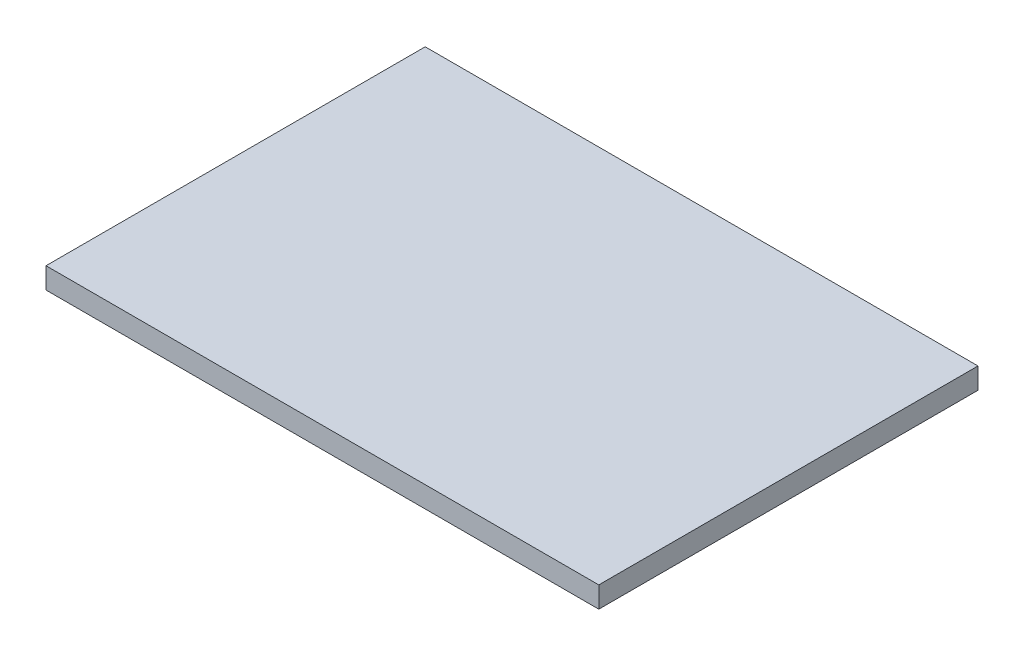
ISO-10303-21;
HEADER;
FILE_DESCRIPTION(('STEP AP214'),'2;1');
FILE_NAME('part.step','',(''),(''),'','','');
FILE_SCHEMA(('AUTOMOTIVE_DESIGN { 1 0 10303 214 1 1 1 1 }'));
ENDSEC;
DATA;
#1=APPLICATION_CONTEXT('core data for automotive mechanical design processes');
#2=APPLICATION_PROTOCOL_DEFINITION('international standard','automotive_design',2000,#1);
#3=PRODUCT_CONTEXT('',#1,'mechanical');
#4=PRODUCT('Part','Part','',(#3));
#5=PRODUCT_RELATED_PRODUCT_CATEGORY('part','',(#4));
#6=PRODUCT_DEFINITION_FORMATION('','',#4);
#7=PRODUCT_DEFINITION_CONTEXT('part definition',#1,'design');
#8=PRODUCT_DEFINITION('design','',#6,#7);
#9=PRODUCT_DEFINITION_SHAPE('','',#8);
#10=(LENGTH_UNIT() NAMED_UNIT(*) SI_UNIT(.MILLI.,.METRE.));
#11=(NAMED_UNIT(*) PLANE_ANGLE_UNIT() SI_UNIT($,.RADIAN.));
#12=(NAMED_UNIT(*) SI_UNIT($,.STERADIAN.) SOLID_ANGLE_UNIT());
#13=UNCERTAINTY_MEASURE_WITH_UNIT(LENGTH_MEASURE(1.E-05),#10,'distance_accuracy_value','');
#14=(GEOMETRIC_REPRESENTATION_CONTEXT(3) GLOBAL_UNCERTAINTY_ASSIGNED_CONTEXT((#13)) GLOBAL_UNIT_ASSIGNED_CONTEXT((#10,
#11,#12)) REPRESENTATION_CONTEXT('',''));
#15=CARTESIAN_POINT('',(0.,0.,0.));
#16=DIRECTION('',(0.,0.,1.));
#17=DIRECTION('',(1.,0.,0.));
#18=AXIS2_PLACEMENT_3D('',#15,#16,#17);
#19=CARTESIAN_POINT('',(-181.809141946319,5.,-28.5521579547219));
#20=DIRECTION('',(1.,0.,0.));
#21=DIRECTION('',(0.,0.,-1.));
#22=AXIS2_PLACEMENT_3D('',#19,#20,#21);
#23=PLANE('',#22);
#24=DIRECTION('',(0.,0.,1.));
#25=VECTOR('',#24,1.);
#26=CARTESIAN_POINT('',(-181.809141946319,0.,-28.5521579547219));
#27=LINE('',#26,#25);
#28=CARTESIAN_POINT('',(-181.809141946319,0.,-28.5521579547219));
#29=VERTEX_POINT('',#28);
#30=CARTESIAN_POINT('',(-181.809141946319,0.,61.4478420452782));
#31=VERTEX_POINT('',#30);
#32=EDGE_CURVE('E99',#29,#31,#27,.T.);
#33=ORIENTED_EDGE('',*,*,#32,.T.);
#34=DIRECTION('',(0.,-1.,0.));
#35=VECTOR('',#34,1.);
#36=CARTESIAN_POINT('',(-181.809141946319,5.,61.4478420452782));
#37=LINE('',#36,#35);
#38=CARTESIAN_POINT('',(-181.809141946319,5.,61.4478420452782));
#39=VERTEX_POINT('',#38);
#40=EDGE_CURVE('E11',#39,#31,#37,.T.);
#41=ORIENTED_EDGE('',*,*,#40,.F.);
#42=DIRECTION('',(0.,0.,1.));
#43=VECTOR('',#42,1.);
#44=CARTESIAN_POINT('',(-181.809141946319,5.,-28.5521579547219));
#45=LINE('',#44,#43);
#46=CARTESIAN_POINT('',(-181.809141946319,5.,-28.5521579547219));
#47=VERTEX_POINT('',#46);
#48=EDGE_CURVE('E87',#47,#39,#45,.T.);
#49=ORIENTED_EDGE('',*,*,#48,.F.);
#50=DIRECTION('',(0.,-1.,0.));
#51=VECTOR('',#50,1.);
#52=CARTESIAN_POINT('',(-181.809141946319,5.,-28.5521579547219));
#53=LINE('',#52,#51);
#54=EDGE_CURVE('E95',#47,#29,#53,.T.);
#55=ORIENTED_EDGE('',*,*,#54,.T.);
#56=EDGE_LOOP('',(#33,#41,#49,#55));
#57=FACE_BOUND('',#56,.T.);
#58=ADVANCED_FACE('F36',(#57),#23,.F.);
#59=CARTESIAN_POINT('',(-181.809141946319,5.,61.4478420452782));
#60=DIRECTION('',(0.,0.,-1.));
#61=DIRECTION('',(-1.,0.,0.));
#62=AXIS2_PLACEMENT_3D('',#59,#60,#61);
#63=PLANE('',#62);
#64=DIRECTION('',(1.,0.,0.));
#65=VECTOR('',#64,1.);
#66=CARTESIAN_POINT('',(-181.809141946319,0.,61.4478420452782));
#67=LINE('',#66,#65);
#68=CARTESIAN_POINT('',(-50.6091419463192,0.,61.4478420452782));
#69=VERTEX_POINT('',#68);
#70=EDGE_CURVE('E91',#31,#69,#67,.T.);
#71=ORIENTED_EDGE('',*,*,#70,.T.);
#72=DIRECTION('',(0.,-1.,0.));
#73=VECTOR('',#72,1.);
#74=CARTESIAN_POINT('',(-50.6091419463192,5.,61.4478420452782));
#75=LINE('',#74,#73);
#76=CARTESIAN_POINT('',(-50.6091419463192,5.,61.4478420452782));
#77=VERTEX_POINT('',#76);
#78=EDGE_CURVE('E44',#77,#69,#75,.T.);
#79=ORIENTED_EDGE('',*,*,#78,.F.);
#80=DIRECTION('',(1.,0.,0.));
#81=VECTOR('',#80,1.);
#82=CARTESIAN_POINT('',(-181.809141946319,5.,61.4478420452782));
#83=LINE('',#82,#81);
#84=EDGE_CURVE('E82',#39,#77,#83,.T.);
#85=ORIENTED_EDGE('',*,*,#84,.F.);
#86=ORIENTED_EDGE('',*,*,#40,.T.);
#87=EDGE_LOOP('',(#71,#79,#85,#86));
#88=FACE_BOUND('',#87,.T.);
#89=ADVANCED_FACE('F90',(#88),#63,.F.);
#90=CARTESIAN_POINT('',(-50.6091419463192,5.,-28.5521579547218));
#91=DIRECTION('',(-1.,0.,0.));
#92=DIRECTION('',(0.,0.,1.));
#93=AXIS2_PLACEMENT_3D('',#90,#91,#92);
#94=PLANE('',#93);
#95=DIRECTION('',(0.,0.,-1.));
#96=VECTOR('',#95,1.);
#97=CARTESIAN_POINT('',(-50.6091419463192,0.,-28.5521579547218));
#98=LINE('',#97,#96);
#99=CARTESIAN_POINT('',(-50.6091419463192,0.,-28.5521579547218));
#100=VERTEX_POINT('',#99);
#101=EDGE_CURVE('E69',#69,#100,#98,.T.);
#102=ORIENTED_EDGE('',*,*,#101,.T.);
#103=DIRECTION('',(0.,-1.,0.));
#104=VECTOR('',#103,1.);
#105=CARTESIAN_POINT('',(-50.6091419463192,5.,-28.5521579547218));
#106=LINE('',#105,#104);
#107=CARTESIAN_POINT('',(-50.6091419463192,5.,-28.5521579547218));
#108=VERTEX_POINT('',#107);
#109=EDGE_CURVE('E92',#108,#100,#106,.T.);
#110=ORIENTED_EDGE('',*,*,#109,.F.);
#111=DIRECTION('',(0.,0.,-1.));
#112=VECTOR('',#111,1.);
#113=CARTESIAN_POINT('',(-50.6091419463192,5.,-28.5521579547218));
#114=LINE('',#113,#112);
#115=EDGE_CURVE('E85',#77,#108,#114,.T.);
#116=ORIENTED_EDGE('',*,*,#115,.F.);
#117=ORIENTED_EDGE('',*,*,#78,.T.);
#118=EDGE_LOOP('',(#102,#110,#116,#117));
#119=FACE_BOUND('',#118,.T.);
#120=ADVANCED_FACE('F93',(#119),#94,.F.);
#121=CARTESIAN_POINT('',(-181.809141946319,5.,-28.5521579547219));
#122=DIRECTION('',(0.,0.,1.));
#123=DIRECTION('',(1.,0.,0.));
#124=AXIS2_PLACEMENT_3D('',#121,#122,#123);
#125=PLANE('',#124);
#126=DIRECTION('',(-1.,0.,0.));
#127=VECTOR('',#126,1.);
#128=CARTESIAN_POINT('',(-181.809141946319,0.,-28.5521579547219));
#129=LINE('',#128,#127);
#130=EDGE_CURVE('E75',#100,#29,#129,.T.);
#131=ORIENTED_EDGE('',*,*,#130,.T.);
#132=ORIENTED_EDGE('',*,*,#54,.F.);
#133=DIRECTION('',(-1.,0.,0.));
#134=VECTOR('',#133,1.);
#135=CARTESIAN_POINT('',(-181.809141946319,5.,-28.5521579547219));
#136=LINE('',#135,#134);
#137=EDGE_CURVE('E52',#108,#47,#136,.T.);
#138=ORIENTED_EDGE('',*,*,#137,.F.);
#139=ORIENTED_EDGE('',*,*,#109,.T.);
#140=EDGE_LOOP('',(#131,#132,#138,#139));
#141=FACE_BOUND('',#140,.T.);
#142=ADVANCED_FACE('F106',(#141),#125,.F.);
#143=CARTESIAN_POINT('',(0.,5.,0.));
#144=DIRECTION('',(0.,1.,0.));
#145=DIRECTION('',(0.,0.,1.));
#146=AXIS2_PLACEMENT_3D('',#143,#144,#145);
#147=PLANE('',#146);
#148=ORIENTED_EDGE('',*,*,#48,.T.);
#149=ORIENTED_EDGE('',*,*,#84,.T.);
#150=ORIENTED_EDGE('',*,*,#115,.T.);
#151=ORIENTED_EDGE('',*,*,#137,.T.);
#152=EDGE_LOOP('',(#148,#149,#150,#151));
#153=FACE_BOUND('',#152,.T.);
#154=ADVANCED_FACE('F83',(#153),#147,.T.);
#155=CARTESIAN_POINT('',(0.,0.,0.));
#156=DIRECTION('',(0.,1.,0.));
#157=DIRECTION('',(0.,0.,1.));
#158=AXIS2_PLACEMENT_3D('',#155,#156,#157);
#159=PLANE('',#158);
#160=ORIENTED_EDGE('',*,*,#32,.F.);
#161=ORIENTED_EDGE('',*,*,#130,.F.);
#162=ORIENTED_EDGE('',*,*,#101,.F.);
#163=ORIENTED_EDGE('',*,*,#70,.F.);
#164=EDGE_LOOP('',(#160,#161,#162,#163));
#165=FACE_BOUND('',#164,.T.);
#166=ADVANCED_FACE('F109',(#165),#159,.F.);
#167=CLOSED_SHELL('',(#58,#89,#120,#142,#154,#166));
#168=MANIFOLD_SOLID_BREP('B2',#167);
#169=ADVANCED_BREP_SHAPE_REPRESENTATION('',(#18,#168),#14);
#170=SHAPE_DEFINITION_REPRESENTATION(#9,#169);
ENDSEC;
END-ISO-10303-21;
